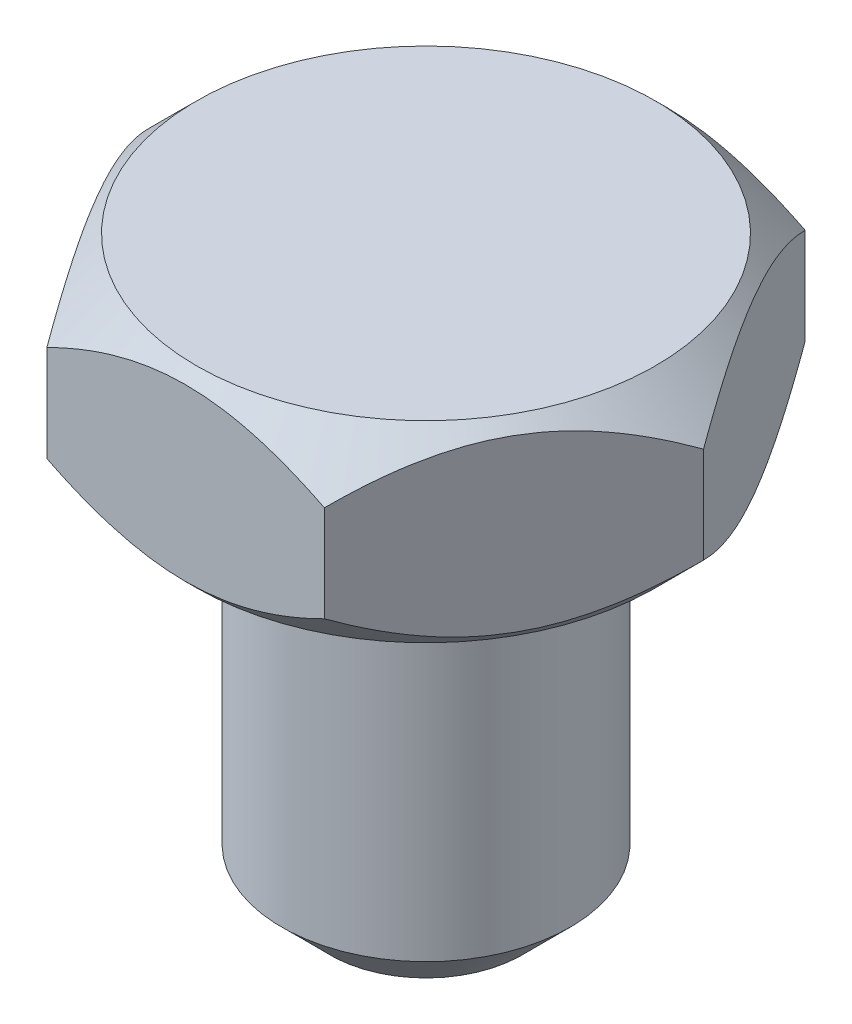
ISO-10303-21;
HEADER;
FILE_DESCRIPTION(('STEP AP214'),'2;1');
FILE_NAME('part.step','',(''),(''),'','','');
FILE_SCHEMA(('AUTOMOTIVE_DESIGN { 1 0 10303 214 1 1 1 1 }'));
ENDSEC;
DATA;
#1=APPLICATION_CONTEXT('core data for automotive mechanical design processes');
#2=APPLICATION_PROTOCOL_DEFINITION('international standard','automotive_design',2000,#1);
#3=PRODUCT_CONTEXT('',#1,'mechanical');
#4=PRODUCT('Part','Part','',(#3));
#5=PRODUCT_RELATED_PRODUCT_CATEGORY('part','',(#4));
#6=PRODUCT_DEFINITION_FORMATION('','',#4);
#7=PRODUCT_DEFINITION_CONTEXT('part definition',#1,'design');
#8=PRODUCT_DEFINITION('design','',#6,#7);
#9=PRODUCT_DEFINITION_SHAPE('','',#8);
#10=(LENGTH_UNIT() NAMED_UNIT(*) SI_UNIT(.MILLI.,.METRE.));
#11=(NAMED_UNIT(*) PLANE_ANGLE_UNIT() SI_UNIT($,.RADIAN.));
#12=(NAMED_UNIT(*) SI_UNIT($,.STERADIAN.) SOLID_ANGLE_UNIT());
#13=UNCERTAINTY_MEASURE_WITH_UNIT(LENGTH_MEASURE(1.E-05),#10,'distance_accuracy_value','');
#14=(GEOMETRIC_REPRESENTATION_CONTEXT(3) GLOBAL_UNCERTAINTY_ASSIGNED_CONTEXT((#13)) GLOBAL_UNIT_ASSIGNED_CONTEXT((#10,
#11,#12)) REPRESENTATION_CONTEXT('',''));
#15=CARTESIAN_POINT('',(0.,0.,0.));
#16=DIRECTION('',(0.,0.,1.));
#17=DIRECTION('',(1.,0.,0.));
#18=AXIS2_PLACEMENT_3D('',#15,#16,#17);
#19=CARTESIAN_POINT('',(-2.88675134594812,-4.,-4.99999999999999));
#20=DIRECTION('',(0.,-1.,0.));
#21=DIRECTION('',(0.,0.,-1.));
#22=AXIS2_PLACEMENT_3D('',#19,#20,#21);
#23=PLANE('',#22);
#24=CARTESIAN_POINT('',(0.,-4.,0.));
#25=DIRECTION('',(0.,1.,0.));
#26=DIRECTION('',(0.,0.,1.));
#27=AXIS2_PLACEMENT_3D('',#24,#25,#26);
#28=CIRCLE('',#27,4.77350269189625);
#29=CARTESIAN_POINT('',(0.,-4.,4.77350269189625));
#30=VERTEX_POINT('',#29);
#31=EDGE_CURVE('E102',#30,#30,#28,.T.);
#32=ORIENTED_EDGE('',*,*,#31,.F.);
#33=EDGE_LOOP('',(#32));
#34=FACE_BOUND('',#33,.T.);
#35=CARTESIAN_POINT('',(0.,-4.,0.));
#36=DIRECTION('',(0.,-1.,0.));
#37=DIRECTION('',(0.,0.,-1.));
#38=AXIS2_PLACEMENT_3D('',#35,#36,#37);
#39=CIRCLE('',#38,3.);
#40=CARTESIAN_POINT('',(0.,-4.,-3.));
#41=VERTEX_POINT('',#40);
#42=EDGE_CURVE('E116',#41,#41,#39,.T.);
#43=ORIENTED_EDGE('',*,*,#42,.F.);
#44=EDGE_LOOP('',(#43));
#45=FACE_BOUND('',#44,.T.);
#46=ADVANCED_FACE('F29',(#34,#45),#23,.T.);
#47=CARTESIAN_POINT('',(0.,-12.,0.));
#48=DIRECTION('',(0.,1.,0.));
#49=DIRECTION('',(0.,0.,1.));
#50=AXIS2_PLACEMENT_3D('',#47,#48,#49);
#51=CYLINDRICAL_SURFACE('',#50,3.);
#52=CARTESIAN_POINT('',(0.,-11.,0.));
#53=DIRECTION('',(0.,-1.,0.));
#54=DIRECTION('',(0.,0.,-1.));
#55=AXIS2_PLACEMENT_3D('',#52,#53,#54);
#56=CIRCLE('',#55,3.);
#57=CARTESIAN_POINT('',(0.,-11.,-3.));
#58=VERTEX_POINT('',#57);
#59=EDGE_CURVE('E42',#58,#58,#56,.F.);
#60=ORIENTED_EDGE('',*,*,#59,.T.);
#61=EDGE_LOOP('',(#60));
#62=FACE_BOUND('',#61,.T.);
#63=ORIENTED_EDGE('',*,*,#42,.T.);
#64=EDGE_LOOP('',(#63));
#65=FACE_BOUND('',#64,.T.);
#66=ADVANCED_FACE('F123',(#62,#65),#51,.T.);
#67=CARTESIAN_POINT('',(0.,-12.,0.));
#68=DIRECTION('',(0.,-1.,0.));
#69=DIRECTION('',(0.,0.,-1.));
#70=AXIS2_PLACEMENT_3D('',#67,#68,#69);
#71=PLANE('',#70);
#72=CARTESIAN_POINT('',(0.,-12.,0.));
#73=DIRECTION('',(0.,-1.,0.));
#74=DIRECTION('',(0.,0.,-1.));
#75=AXIS2_PLACEMENT_3D('',#72,#73,#74);
#76=CIRCLE('',#75,2.);
#77=CARTESIAN_POINT('',(0.,-12.,-2.));
#78=VERTEX_POINT('',#77);
#79=EDGE_CURVE('E117',#78,#78,#76,.T.);
#80=ORIENTED_EDGE('',*,*,#79,.T.);
#81=EDGE_LOOP('',(#80));
#82=FACE_BOUND('',#81,.T.);
#83=ADVANCED_FACE('F129',(#82),#71,.T.);
#84=CARTESIAN_POINT('',(0.,-12.,0.));
#85=DIRECTION('',(0.,1.,0.));
#86=DIRECTION('',(0.,0.,1.));
#87=AXIS2_PLACEMENT_3D('',#84,#85,#86);
#88=CONICAL_SURFACE('',#87,2.,0.785398163397447);
#89=ORIENTED_EDGE('',*,*,#59,.F.);
#90=EDGE_LOOP('',(#89));
#91=FACE_BOUND('',#90,.T.);
#92=ORIENTED_EDGE('',*,*,#79,.F.);
#93=EDGE_LOOP('',(#92));
#94=FACE_BOUND('',#93,.T.);
#95=ADVANCED_FACE('F126',(#91,#94),#88,.T.);
#96=CARTESIAN_POINT('',(0.,-4.,0.));
#97=DIRECTION('',(0.,1.,0.));
#98=DIRECTION('',(0.,0.,1.));
#99=AXIS2_PLACEMENT_3D('',#96,#97,#98);
#100=CONICAL_SURFACE('',#99,4.77350269189625,0.785398163397448);
#101=CARTESIAN_POINT('',(-5.77361816195009,-2.99988452648213,0.000200000000039934));
#102=CARTESIAN_POINT('',(-5.72398176110225,-3.04951645439574,-0.0857727681732677));
#103=CARTESIAN_POINT('',(-5.6739638280717,-3.0976252747131,-0.17240636947177));
#104=CARTESIAN_POINT('',(-5.57309004377303,-3.19033336867022,-0.3471248890288));
#105=CARTESIAN_POINT('',(-5.52223375293569,-3.23493072549852,-0.435210568643571));
#106=CARTESIAN_POINT('',(-5.36782257743899,-3.36314092787175,-0.702658569860292));
#107=CARTESIAN_POINT('',(-5.26296050943971,-3.44062493449848,-0.884284999421792));
#108=CARTESIAN_POINT('',(-5.05149774994706,-3.57331105557449,-1.25054924277179));
#109=CARTESIAN_POINT('',(-4.94495110937142,-3.62884745935417,-1.43509343762457));
#110=CARTESIAN_POINT('',(-4.78337944338746,-3.69308950595249,-1.71494377217234));
#111=CARTESIAN_POINT('',(-4.72928433986568,-3.71131783666137,-1.80863923991277));
#112=CARTESIAN_POINT('',(-4.62063609179559,-3.74100781287389,-1.9968235257235));
#113=CARTESIAN_POINT('',(-4.56608301694085,-3.75247046969492,-2.09131222308102));
#114=CARTESIAN_POINT('',(-4.43314578685872,-3.77168913825403,-2.32156625980075));
#115=CARTESIAN_POINT('',(-4.35461839928598,-3.7757217117403,-2.4575796848624));
#116=CARTESIAN_POINT('',(-4.19770514602325,-3.7689541458947,-2.72936141189436));
#117=CARTESIAN_POINT('',(-4.11931933958609,-3.75814880702901,-2.86512961123579));
#118=CARTESIAN_POINT('',(-3.96328672226451,-3.72234235010197,-3.13538603207472));
#119=CARTESIAN_POINT('',(-3.88564083675503,-3.69732535604175,-3.26987265077581));
#120=CARTESIAN_POINT('',(-3.73168360440634,-3.63445567501058,-3.53653439939643));
#121=CARTESIAN_POINT('',(-3.65537215571136,-3.59660397223245,-3.66870970573533));
#122=CARTESIAN_POINT('',(-3.51990355411976,-3.51873011323948,-3.90334820652228));
#123=CARTESIAN_POINT('',(-3.4604464736886,-3.480755749581,-4.00633089069876));
#124=CARTESIAN_POINT('',(-3.34259967462161,-3.39868737382607,-4.21044753419214));
#125=CARTESIAN_POINT('',(-3.28420998845894,-3.35459317589646,-4.31158143726389));
#126=CARTESIAN_POINT('',(-3.16868188148908,-3.26127361464765,-4.51168198823795));
#127=CARTESIAN_POINT('',(-3.11154017495448,-3.21206438729062,-4.61065432718707));
#128=CARTESIAN_POINT('',(-2.99831490663731,-3.109160877157,-4.80676624461303));
#129=CARTESIAN_POINT('',(-2.94223072132828,-3.05546934545098,-4.90390690306937));
#130=CARTESIAN_POINT('',(-2.88663587589429,-2.99988452648214,-5.00019999999999));
#131=B_SPLINE_CURVE_WITH_KNOTS('',3,(#101,#102,#103,#104,#105,#106,#107,#108,#109,#110,#111,
#112,#113,#114,#115,#116,#117,#118,#119,#120,#121,#122,#123,#124,#125,#126,#127,#128,#129,#130),
.UNSPECIFIED.,.F.,.F.,(4,2,2,2,2,2,2,2,2,2,2,2,2,2,4),(0.,0.332945616209569,0.666071736106993,
1.33592065243335,1.99513262597482,2.32409207808825,2.65300234563692,3.12358963991984,
3.59434188052354,4.06562104077027,4.5368640704961,4.91117956742317,5.28550643319671,
5.65868635377117,6.03163889109475),.UNSPECIFIED.);
#132=CARTESIAN_POINT('',(-5.77350269189625,-3.,0.));
#133=VERTEX_POINT('',#132);
#134=CARTESIAN_POINT('',(-2.88675134594813,-3.,-4.99999999999999));
#135=VERTEX_POINT('',#134);
#136=EDGE_CURVE('E174',#133,#135,#131,.T.);
#137=ORIENTED_EDGE('',*,*,#136,.T.);
#138=CARTESIAN_POINT('',(-5.93336867910423,-1.0143233614403,-4.99999999999999));
#139=CARTESIAN_POINT('',(-5.78966341948587,-1.1241885817879,-4.99999999999999));
#140=CARTESIAN_POINT('',(-5.64517359422455,-1.23304389822759,-4.99999999999999));
#141=CARTESIAN_POINT('',(-5.35430787651161,-1.44827641705777,-4.99999999999999));
#142=CARTESIAN_POINT('',(-5.20793153723386,-1.55465301495845,-4.99999999999999));
#143=CARTESIAN_POINT('',(-4.9119053610751,-1.76522692025996,-4.99999999999999));
#144=CARTESIAN_POINT('',(-4.7622389674382,-1.86940102910427,-4.99999999999999));
#145=CARTESIAN_POINT('',(-4.4603979301907,-2.07403749362642,-4.99999999999999));
#146=CARTESIAN_POINT('',(-4.30822346176151,-2.17450010696542,-4.99999999999999));
#147=CARTESIAN_POINT('',(-3.99153933620166,-2.37689028562685,-4.99999999999999));
#148=CARTESIAN_POINT('',(-3.82684512877714,-2.47853053625136,-4.99999999999999));
#149=CARTESIAN_POINT('',(-3.49359569305951,-2.67537782448448,-4.99999999999999));
#150=CARTESIAN_POINT('',(-3.32503983391761,-2.77058380079454,-4.99999999999999));
#151=CARTESIAN_POINT('',(-2.98404180965613,-2.95252582018176,-4.99999999999999));
#152=CARTESIAN_POINT('',(-2.81161302726992,-3.03928674909056,-4.99999999999999));
#153=CARTESIAN_POINT('',(-2.4619377508861,-3.20239520740955,-4.99999999999999));
#154=CARTESIAN_POINT('',(-2.28469354573479,-3.27874758379917,-4.99999999999999));
#155=CARTESIAN_POINT('',(-1.94171568558995,-3.41181755173878,-4.99999999999999));
#156=CARTESIAN_POINT('',(-1.77643834256962,-3.46969922851381,-4.99999999999999));
#157=CARTESIAN_POINT('',(-1.44175059438624,-3.57222452709261,-4.99999999999999));
#158=CARTESIAN_POINT('',(-1.27233991994473,-3.61686728390092,-4.99999999999999));
#159=CARTESIAN_POINT('',(-0.933301891878295,-3.68978435588989,-4.99999999999999));
#160=CARTESIAN_POINT('',(-0.763738295172394,-3.71835018807338,-4.99999999999999));
#161=CARTESIAN_POINT('',(-0.422603458667702,-3.75853073066782,-4.99999999999999));
#162=CARTESIAN_POINT('',(-0.251032616590633,-3.7701487436941,-4.99999999999999));
#163=CARTESIAN_POINT('',(0.0853406388539586,-3.77548648250807,-4.99999999999999));
#164=CARTESIAN_POINT('',(0.250131876658651,-3.76992113564033,-4.99999999999999));
#165=CARTESIAN_POINT('',(0.578387101858167,-3.74282076274746,-4.99999999999999));
#166=CARTESIAN_POINT('',(0.741850964252607,-3.72128424993436,-4.99999999999999));
#167=CARTESIAN_POINT('',(1.06903592592894,-3.66307865086045,-4.99999999999999));
#168=CARTESIAN_POINT('',(1.23270929845992,-3.62614570544629,-4.99999999999999));
#169=CARTESIAN_POINT('',(1.55646565066118,-3.53916921466345,-4.99999999999999));
#170=CARTESIAN_POINT('',(1.71654886698276,-3.48912653621913,-4.99999999999999));
#171=CARTESIAN_POINT('',(2.04376834721888,-3.37425220624934,-4.99999999999999));
#172=CARTESIAN_POINT('',(2.21062650526836,-3.30863700466564,-4.99999999999999));
#173=CARTESIAN_POINT('',(2.54003854131556,-3.16728810798752,-4.99999999999999));
#174=CARTESIAN_POINT('',(2.7025904176521,-3.0915498029936,-4.99999999999999));
#175=CARTESIAN_POINT('',(3.02416565802373,-2.9317524021677,-4.99999999999999));
#176=CARTESIAN_POINT('',(3.1831761026048,-2.84766751767455,-4.99999999999999));
#177=CARTESIAN_POINT('',(3.49754870709798,-2.67302987151769,-4.99999999999999));
#178=CARTESIAN_POINT('',(3.65291142946937,-2.58247811583028,-4.99999999999999));
#179=CARTESIAN_POINT('',(3.95285892432342,-2.40078159251411,-4.99999999999999));
#180=CARTESIAN_POINT('',(4.09759659911003,-2.30988790532247,-4.99999999999999));
#181=CARTESIAN_POINT('',(4.38458573992775,-2.12424528238796,-4.99999999999999));
#182=CARTESIAN_POINT('',(4.52683701776729,-2.02949605661615,-4.99999999999999));
#183=CARTESIAN_POINT('',(4.80803186770968,-1.83760520698687,-4.99999999999999));
#184=CARTESIAN_POINT('',(4.94699285705844,-1.74048901451515,-4.99999999999999));
#185=CARTESIAN_POINT('',(5.22301057132509,-1.54366358089934,-4.99999999999999));
#186=CARTESIAN_POINT('',(5.36006781033932,-1.44395506153836,-4.99999999999999));
#187=CARTESIAN_POINT('',(5.49632687048856,-1.34318580314551,-4.99999999999999));
#188=B_SPLINE_CURVE_WITH_KNOTS('',3,(#138,#139,#140,#141,#142,#143,#144,#145,#146,#147,#148,
#149,#150,#151,#152,#153,#154,#155,#156,#157,#158,#159,#160,#161,#162,#163,#164,#165,#166,#167,
#168,#169,#170,#171,#172,#173,#174,#175,#176,#177,#178,#179,#180,#181,#182,#183,#184,#185,#186,
#187),.UNSPECIFIED.,.F.,.F.,(4,2,2,2,2,2,2,2,2,2,2,2,2,2,2,2,2,2,2,2,2,2,2,2,4),(0.,
0.542683335711663,1.08549766009344,1.63250741832322,2.17947913015188,2.75996048819956,
3.34053736097748,3.91934802264124,4.49788822043794,5.02279153401111,5.54772913580436,
6.06281331680062,6.57779711011592,7.0716474990381,7.56554386725873,8.06827708076712,
8.57097705777059,9.10845041736518,9.64616937298291,10.1856047538602,10.7249564030361,
11.2376185039342,11.7503192408631,12.2588884723274,12.7673175877714),.UNSPECIFIED.);
#189=CARTESIAN_POINT('',(2.88675134594814,-3.,-4.99999999999999));
#190=VERTEX_POINT('',#189);
#191=EDGE_CURVE('E168',#135,#190,#188,.T.);
#192=ORIENTED_EDGE('',*,*,#191,.T.);
#193=CARTESIAN_POINT('',(2.8866358758943,-2.99988452648213,-5.00019999999999));
#194=CARTESIAN_POINT('',(2.93627227674214,-3.04951645439574,-4.91422723182668));
#195=CARTESIAN_POINT('',(2.98629020977269,-3.09762527471309,-4.82759363052818));
#196=CARTESIAN_POINT('',(3.08716399407136,-3.19033336867022,-4.65287511097115));
#197=CARTESIAN_POINT('',(3.1380202849087,-3.23493072549851,-4.56478943135638));
#198=CARTESIAN_POINT('',(3.2924314604054,-3.36314092787174,-4.29734143013966));
#199=CARTESIAN_POINT('',(3.39729352840468,-3.44062493449848,-4.11571500057816));
#200=CARTESIAN_POINT('',(3.60875628789733,-3.57331105557448,-3.74945075722817));
#201=CARTESIAN_POINT('',(3.71530292847297,-3.62884745935416,-3.56490656237539));
#202=CARTESIAN_POINT('',(3.87687459445693,-3.69308950595248,-3.28505622782762));
#203=CARTESIAN_POINT('',(3.93096969797871,-3.71131783666136,-3.1913607600872));
#204=CARTESIAN_POINT('',(4.03961794604879,-3.74100781287387,-3.00317647427646));
#205=CARTESIAN_POINT('',(4.09417102090353,-3.75247046969491,-2.90868777691894));
#206=CARTESIAN_POINT('',(4.22710825098566,-3.77168913825401,-2.67843374019922));
#207=CARTESIAN_POINT('',(4.30563563855841,-3.77572171174028,-2.54242031513757));
#208=CARTESIAN_POINT('',(4.46254889182113,-3.76895414589469,-2.2706385881056));
#209=CARTESIAN_POINT('',(4.5409346982583,-3.758148807029,-2.13487038876418));
#210=CARTESIAN_POINT('',(4.69696731557988,-3.72234235010196,-1.86461396792524));
#211=CARTESIAN_POINT('',(4.77461320108935,-3.69732535604173,-1.73012734922416));
#212=CARTESIAN_POINT('',(4.92857043343804,-3.63445567501056,-1.46346560060354));
#213=CARTESIAN_POINT('',(5.00488188213303,-3.59660397223244,-1.33129029426463));
#214=CARTESIAN_POINT('',(5.14035048372462,-3.51873011323946,-1.09665179347768));
#215=CARTESIAN_POINT('',(5.19980756415579,-3.48075574958098,-0.993669109301198));
#216=CARTESIAN_POINT('',(5.31765436322278,-3.39868737382605,-0.789552465807815));
#217=CARTESIAN_POINT('',(5.37604404938545,-3.35459317589644,-0.688418562736064));
#218=CARTESIAN_POINT('',(5.49157215635532,-3.26127361464763,-0.488318011762002));
#219=CARTESIAN_POINT('',(5.54871386288992,-3.21206438729059,-0.389345672812883));
#220=CARTESIAN_POINT('',(5.66193913120709,-3.10916087715698,-0.193233755386925));
#221=CARTESIAN_POINT('',(5.71802331651611,-3.05546934545096,-0.0960930969305827));
#222=CARTESIAN_POINT('',(5.77361816195011,-2.99988452648211,0.000200000000038896));
#223=B_SPLINE_CURVE_WITH_KNOTS('',3,(#193,#194,#195,#196,#197,#198,#199,#200,#201,#202,#203,
#204,#205,#206,#207,#208,#209,#210,#211,#212,#213,#214,#215,#216,#217,#218,#219,#220,#221,#222),
.UNSPECIFIED.,.F.,.F.,(4,2,2,2,2,2,2,2,2,2,2,2,2,2,4),(0.,0.332945616209567,0.666071736106988,
1.33592065243334,1.99513262597481,2.32409207808823,2.6530023456369,3.12358963991982,
3.59434188052352,4.06562104077025,4.53686407049609,4.91117956742316,5.28550643319671,
5.65868635377117,6.03163889109475),.UNSPECIFIED.);
#224=CARTESIAN_POINT('',(5.77350269189625,-3.,0.));
#225=VERTEX_POINT('',#224);
#226=EDGE_CURVE('E90',#190,#225,#223,.T.);
#227=ORIENTED_EDGE('',*,*,#226,.T.);
#228=CARTESIAN_POINT('',(5.77361816195011,-2.99988452648211,-0.000199999999961444));
#229=CARTESIAN_POINT('',(5.72398176110227,-3.04951645439572,0.0857727681733452));
#230=CARTESIAN_POINT('',(5.67396382807171,-3.09762527471308,0.172406369471847));
#231=CARTESIAN_POINT('',(5.57309004377305,-3.1903333686702,0.347124889028876));
#232=CARTESIAN_POINT('',(5.52223375293571,-3.23493072549849,0.435210568643646));
#233=CARTESIAN_POINT('',(5.36782257743901,-3.36314092787172,0.702658569860365));
#234=CARTESIAN_POINT('',(5.26296050943973,-3.44062493449846,0.884284999421863));
#235=CARTESIAN_POINT('',(5.05149774994707,-3.57331105557446,1.25054924277185));
#236=CARTESIAN_POINT('',(4.94495110937143,-3.62884745935414,1.43509343762464));
#237=CARTESIAN_POINT('',(4.78337944338747,-3.69308950595246,1.71494377217241));
#238=CARTESIAN_POINT('',(4.72928433986569,-3.71131783666134,1.80863923991283));
#239=CARTESIAN_POINT('',(4.62063609179561,-3.74100781287386,1.99682352572356));
#240=CARTESIAN_POINT('',(4.56608301694086,-3.75247046969489,2.09131222308108));
#241=CARTESIAN_POINT('',(4.43314578685873,-3.77168913825399,2.3215662598008));
#242=CARTESIAN_POINT('',(4.35461839928598,-3.77572171174026,2.45757968486246));
#243=CARTESIAN_POINT('',(4.19770514602326,-3.76895414589467,2.72936141189442));
#244=CARTESIAN_POINT('',(4.11931933958609,-3.75814880702898,2.86512961123585));
#245=CARTESIAN_POINT('',(3.96328672226451,-3.72234235010194,3.13538603207478));
#246=CARTESIAN_POINT('',(3.88564083675503,-3.69732535604171,3.26987265077587));
#247=CARTESIAN_POINT('',(3.73168360440634,-3.63445567501054,3.53653439939649));
#248=CARTESIAN_POINT('',(3.65537215571135,-3.59660397223241,3.66870970573539));
#249=CARTESIAN_POINT('',(3.51990355411976,-3.51873011323944,3.90334820652233));
#250=CARTESIAN_POINT('',(3.46044647368859,-3.48075574958096,4.00633089069881));
#251=CARTESIAN_POINT('',(3.34259967462161,-3.39868737382603,4.21044753419218));
#252=CARTESIAN_POINT('',(3.28420998845894,-3.35459317589643,4.31158143726393));
#253=CARTESIAN_POINT('',(3.16868188148908,-3.26127361464762,4.51168198823798));
#254=CARTESIAN_POINT('',(3.11154017495448,-3.21206438729059,4.6106543271871));
#255=CARTESIAN_POINT('',(2.99831490663731,-3.10916087715698,4.80676624461305));
#256=CARTESIAN_POINT('',(2.94223072132829,-3.05546934545097,4.90390690306938));
#257=CARTESIAN_POINT('',(2.8866358758943,-2.99988452648212,5.0002));
#258=B_SPLINE_CURVE_WITH_KNOTS('',3,(#228,#229,#230,#231,#232,#233,#234,#235,#236,#237,#238,
#239,#240,#241,#242,#243,#244,#245,#246,#247,#248,#249,#250,#251,#252,#253,#254,#255,#256,#257),
.UNSPECIFIED.,.F.,.F.,(4,2,2,2,2,2,2,2,2,2,2,2,2,2,4),(0.,0.332945616209567,0.666071736106989,
1.33592065243334,1.99513262597481,2.32409207808823,2.6530023456369,3.12358963991982,
3.59434188052353,4.06562104077026,4.5368640704961,4.91117956742315,5.28550643319668,
5.65868635377112,6.03163889109469),.UNSPECIFIED.);
#259=CARTESIAN_POINT('',(2.88675134594812,-3.,5.));
#260=VERTEX_POINT('',#259);
#261=EDGE_CURVE('E86',#225,#260,#258,.T.);
#262=ORIENTED_EDGE('',*,*,#261,.T.);
#263=CARTESIAN_POINT('',(-5.93336867913979,-1.01432336141309,5.));
#264=CARTESIAN_POINT('',(-5.78966341952042,-1.12418858176174,5.));
#265=CARTESIAN_POINT('',(-5.64517359425808,-1.23304389820249,5.));
#266=CARTESIAN_POINT('',(-5.35430787654308,-1.44827641703476,5.));
#267=CARTESIAN_POINT('',(-5.20793153726431,-1.55465301493648,5.));
#268=CARTESIAN_POINT('',(-4.91190536110345,-1.76522692024009,5.));
#269=CARTESIAN_POINT('',(-4.76223896746549,-1.86940102908545,5.));
#270=CARTESIAN_POINT('',(-4.46039793021584,-2.07403749360968,5.));
#271=CARTESIAN_POINT('',(-4.30822346178557,-2.17450010694972,5.));
#272=CARTESIAN_POINT('',(-3.99153933622338,-2.37689028561331,5.));
#273=CARTESIAN_POINT('',(-3.82684512879759,-2.47853053623893,5.));
#274=CARTESIAN_POINT('',(-3.49359569307741,-2.67537782447423,5.));
#275=CARTESIAN_POINT('',(-3.3250398339342,-2.77058380078536,5.));
#276=CARTESIAN_POINT('',(-2.98404180967006,-2.95252582017463,5.));
#277=CARTESIAN_POINT('',(-2.81161302728251,-3.0392867490844,5.));
#278=CARTESIAN_POINT('',(-2.46193775089592,-3.20239520740523,5.));
#279=CARTESIAN_POINT('',(-2.28469354574318,-3.2787475837957,5.));
#280=CARTESIAN_POINT('',(-1.94171568559774,-3.41181755173593,5.));
#281=CARTESIAN_POINT('',(-1.7764383425783,-3.46969922851087,5.));
#282=CARTESIAN_POINT('',(-1.44175059439672,-3.57222452708967,5.));
#283=CARTESIAN_POINT('',(-1.27233991995613,-3.61686728389806,5.));
#284=CARTESIAN_POINT('',(-0.933301891891501,-3.68978435588743,5.));
#285=CARTESIAN_POINT('',(-0.763738295186488,-3.71835018807121,5.));
#286=CARTESIAN_POINT('',(-0.422603458683547,-3.75853073066644,5.));
#287=CARTESIAN_POINT('',(-0.251032616607341,-3.77014874369322,5.));
#288=CARTESIAN_POINT('',(0.0853406388357411,-3.77548648250835,5.));
#289=CARTESIAN_POINT('',(0.250131876639783,-3.76992113564124,5.));
#290=CARTESIAN_POINT('',(0.578387101838071,-3.74282076274974,5.));
#291=CARTESIAN_POINT('',(0.741850964231932,-3.72128424993737,5.));
#292=CARTESIAN_POINT('',(1.06903592590712,-3.66307865086499,5.));
#293=CARTESIAN_POINT('',(1.23270929843754,-3.62614570545163,5.));
#294=CARTESIAN_POINT('',(1.55646565063773,-3.5391692146704,5.));
#295=CARTESIAN_POINT('',(1.71654886695881,-3.4891265362269,5.));
#296=CARTESIAN_POINT('',(2.04376834719211,-3.3742522062594,5.));
#297=CARTESIAN_POINT('',(2.21062650523935,-3.30863700467733,5.));
#298=CARTESIAN_POINT('',(2.54003854128215,-3.16728810800261,5.));
#299=CARTESIAN_POINT('',(2.70259041761655,-3.09154980301047,5.));
#300=CARTESIAN_POINT('',(3.02416565798398,-2.93175240218824,5.));
#301=CARTESIAN_POINT('',(3.18317610256299,-2.84766751769698,5.));
#302=CARTESIAN_POINT('',(3.49754870705211,-2.67302987154396,5.));
#303=CARTESIAN_POINT('',(3.65291142942151,-2.58247811585849,5.));
#304=CARTESIAN_POINT('',(3.95285892427193,-2.40078159254602,5.));
#305=CARTESIAN_POINT('',(4.09759659905692,-2.30988790535612,5.));
#306=CARTESIAN_POINT('',(4.38458573987138,-2.1242452824251,5.));
#307=CARTESIAN_POINT('',(4.52683701770932,-2.02949605665505,5.));
#308=CARTESIAN_POINT('',(4.80803186764853,-1.83760520702925,5.));
#309=CARTESIAN_POINT('',(4.94699285699572,-1.74048901455926,5.));
#310=CARTESIAN_POINT('',(5.22301057125923,-1.54366358094691,5.));
#311=CARTESIAN_POINT('',(5.3600678102719,-1.44395506158765,5.));
#312=CARTESIAN_POINT('',(5.49632687041958,-1.34318580319653,5.));
#313=B_SPLINE_CURVE_WITH_KNOTS('',3,(#263,#264,#265,#266,#267,#268,#269,#270,#271,#272,#273,
#274,#275,#276,#277,#278,#279,#280,#281,#282,#283,#284,#285,#286,#287,#288,#289,#290,#291,#292,
#293,#294,#295,#296,#297,#298,#299,#300,#301,#302,#303,#304,#305,#306,#307,#308,#309,#310,#311,
#312),.UNSPECIFIED.,.F.,.F.,(4,2,2,2,2,2,2,2,2,2,2,2,2,2,2,2,2,2,2,2,2,2,2,2,4),(0.,
0.542683335716004,1.08549766010212,1.63250741833633,2.17947913016941,2.75996048822207,
3.34053736100496,3.91934802267365,4.49788822047528,5.02279153404586,5.54772913583653,
6.06281331683033,6.57779711014316,7.07164749906334,7.56554386728196,8.06827708078817,
8.57097705778948,9.108450417376,9.64616937298566,10.1856047538548,10.7249564030226,
11.2376185039138,11.7503192408357,12.2588884722932,12.7673175877304),.UNSPECIFIED.);
#314=CARTESIAN_POINT('',(-2.88675134594811,-3.,5.));
#315=VERTEX_POINT('',#314);
#316=EDGE_CURVE('E48',#260,#315,#313,.F.);
#317=ORIENTED_EDGE('',*,*,#316,.T.);
#318=CARTESIAN_POINT('',(-2.88663587589427,-2.99988452648213,5.0002));
#319=CARTESIAN_POINT('',(-2.93627227674211,-3.04951645439574,4.9142272318267));
#320=CARTESIAN_POINT('',(-2.98629020977267,-3.0976252747131,4.82759363052819));
#321=CARTESIAN_POINT('',(-3.08716399407133,-3.19033336867022,4.65287511097117));
#322=CARTESIAN_POINT('',(-3.13802028490867,-3.23493072549851,4.5647894313564));
#323=CARTESIAN_POINT('',(-3.29243146040537,-3.36314092787174,4.29734143013968));
#324=CARTESIAN_POINT('',(-3.39729352840465,-3.44062493449848,4.11571500057818));
#325=CARTESIAN_POINT('',(-3.60875628789731,-3.57331105557448,3.74945075722819));
#326=CARTESIAN_POINT('',(-3.71530292847294,-3.62884745935416,3.56490656237541));
#327=CARTESIAN_POINT('',(-3.8768745944569,-3.69308950595248,3.28505622782764));
#328=CARTESIAN_POINT('',(-3.93096969797869,-3.71131783666136,3.19136076008722));
#329=CARTESIAN_POINT('',(-4.03961794604877,-3.74100781287387,3.00317647427649));
#330=CARTESIAN_POINT('',(-4.09417102090351,-3.75247046969491,2.90868777691897));
#331=CARTESIAN_POINT('',(-4.22710825098564,-3.77168913825401,2.67843374019925));
#332=CARTESIAN_POINT('',(-4.30563563855839,-3.77572171174028,2.5424203151376));
#333=CARTESIAN_POINT('',(-4.46254889182112,-3.76895414589469,2.27063858810564));
#334=CARTESIAN_POINT('',(-4.54093469825828,-3.758148807029,2.13487038876421));
#335=CARTESIAN_POINT('',(-4.69696731557987,-3.72234235010196,1.86461396792528));
#336=CARTESIAN_POINT('',(-4.77461320108934,-3.69732535604173,1.73012734922419));
#337=CARTESIAN_POINT('',(-4.92857043343803,-3.63445567501056,1.46346560060357));
#338=CARTESIAN_POINT('',(-5.00488188213302,-3.59660397223243,1.33129029426467));
#339=CARTESIAN_POINT('',(-5.14035048372461,-3.51873011323946,1.09665179347773));
#340=CARTESIAN_POINT('',(-5.19980756415578,-3.48075574958098,0.993669109301244));
#341=CARTESIAN_POINT('',(-5.31765436322276,-3.39868737382605,0.789552465807868));
#342=CARTESIAN_POINT('',(-5.37604404938544,-3.35459317589644,0.68841856273612));
#343=CARTESIAN_POINT('',(-5.4915721563553,-3.26127361464764,0.488318011762065));
#344=CARTESIAN_POINT('',(-5.5487138628899,-3.21206438729061,0.389345672812949));
#345=CARTESIAN_POINT('',(-5.66193913120707,-3.10916087715699,0.193233755386997));
#346=CARTESIAN_POINT('',(-5.71802331651609,-3.05546934545098,0.0960930969306584));
#347=CARTESIAN_POINT('',(-5.77361816195009,-2.99988452648213,-0.000199999999959808));
#348=B_SPLINE_CURVE_WITH_KNOTS('',3,(#318,#319,#320,#321,#322,#323,#324,#325,#326,#327,#328,
#329,#330,#331,#332,#333,#334,#335,#336,#337,#338,#339,#340,#341,#342,#343,#344,#345,#346,#347),
.UNSPECIFIED.,.F.,.F.,(4,2,2,2,2,2,2,2,2,2,2,2,2,2,4),(0.,0.332945616209565,0.666071736106984,
1.33592065243333,1.9951326259748,2.32409207808822,2.65300234563688,3.12358963991981,
3.59434188052351,4.06562104077024,4.53686407049607,4.91117956742313,5.28550643319667,
5.65868635377112,6.03163889109469),.UNSPECIFIED.);
#349=EDGE_CURVE('E11',#315,#133,#348,.T.);
#350=ORIENTED_EDGE('',*,*,#349,.T.);
#351=EDGE_LOOP('',(#137,#192,#227,#262,#317,#350));
#352=FACE_BOUND('',#351,.T.);
#353=ORIENTED_EDGE('',*,*,#31,.T.);
#354=EDGE_LOOP('',(#353));
#355=FACE_BOUND('',#354,.T.);
#356=ADVANCED_FACE('F87',(#352,#355),#100,.T.);
#357=CARTESIAN_POINT('',(-2.88675134594812,0.,-4.99999999999999));
#358=DIRECTION('',(0.,-1.,0.));
#359=DIRECTION('',(0.,0.,-1.));
#360=AXIS2_PLACEMENT_3D('',#357,#358,#359);
#361=PLANE('',#360);
#362=CARTESIAN_POINT('',(0.,0.,0.));
#363=DIRECTION('',(0.,1.,0.));
#364=DIRECTION('',(0.,0.,1.));
#365=AXIS2_PLACEMENT_3D('',#362,#363,#364);
#366=CIRCLE('',#365,4.77350269189625);
#367=CARTESIAN_POINT('',(0.,0.,4.77350269189625));
#368=VERTEX_POINT('',#367);
#369=EDGE_CURVE('E234',#368,#368,#366,.T.);
#370=ORIENTED_EDGE('',*,*,#369,.T.);
#371=EDGE_LOOP('',(#370));
#372=FACE_BOUND('',#371,.T.);
#373=ADVANCED_FACE('F149',(#372),#361,.F.);
#374=CARTESIAN_POINT('',(0.,-1.,0.));
#375=DIRECTION('',(0.,-1.,0.));
#376=DIRECTION('',(0.,0.,-1.));
#377=AXIS2_PLACEMENT_3D('',#374,#375,#376);
#378=CONICAL_SURFACE('',#377,5.77350269189625,0.785398163397448);
#379=CARTESIAN_POINT('',(-2.88663587589429,-1.00011547351786,-5.00019999999999));
#380=CARTESIAN_POINT('',(-2.93627227674212,-0.950483545604256,-4.91422723182668));
#381=CARTESIAN_POINT('',(-2.98629020977268,-0.9023747252869,-4.82759363052818));
#382=CARTESIAN_POINT('',(-3.08716399407134,-0.809666631329774,-4.65287511097115));
#383=CARTESIAN_POINT('',(-3.13802028490868,-0.765069274501481,-4.56478943135638));
#384=CARTESIAN_POINT('',(-3.29243146040538,-0.636859072128249,-4.29734143013966));
#385=CARTESIAN_POINT('',(-3.39729352840466,-0.559375065501513,-4.11571500057816));
#386=CARTESIAN_POINT('',(-3.60875628789731,-0.426688944425509,-3.74945075722817));
#387=CARTESIAN_POINT('',(-3.71530292847295,-0.371152540645828,-3.56490656237538));
#388=CARTESIAN_POINT('',(-3.87687459445691,-0.306910494047508,-3.28505622782761));
#389=CARTESIAN_POINT('',(-3.93096969797869,-0.288682163338628,-3.19136076008719));
#390=CARTESIAN_POINT('',(-4.03961794604878,-0.258992187126111,-3.00317647427646));
#391=CARTESIAN_POINT('',(-4.09417102090352,-0.247529530305075,-2.90868777691894));
#392=CARTESIAN_POINT('',(-4.22710825098565,-0.228310861745972,-2.67843374019921));
#393=CARTESIAN_POINT('',(-4.30563563855839,-0.224278288259702,-2.54242031513756));
#394=CARTESIAN_POINT('',(-4.46254889182112,-0.231045854105298,-2.2706385881056));
#395=CARTESIAN_POINT('',(-4.54093469825828,-0.241851192970986,-2.13487038876417));
#396=CARTESIAN_POINT('',(-4.69696731557986,-0.277657649898025,-1.86461396792524));
#397=CARTESIAN_POINT('',(-4.77461320108934,-0.302674643958249,-1.73012734922415));
#398=CARTESIAN_POINT('',(-4.92857043343803,-0.365544324989421,-1.46346560060353));
#399=CARTESIAN_POINT('',(-5.00488188213301,-0.403396027767546,-1.33129029426463));
#400=CARTESIAN_POINT('',(-5.14035048372461,-0.481269886760524,-1.09665179347768));
#401=CARTESIAN_POINT('',(-5.19980756415577,-0.519244250419005,-0.993669109301196));
#402=CARTESIAN_POINT('',(-5.31765436322276,-0.601312626173935,-0.789552465807814));
#403=CARTESIAN_POINT('',(-5.37604404938543,-0.645406824103543,-0.688418562736063));
#404=CARTESIAN_POINT('',(-5.4915721563553,-0.738726385352354,-0.488318011762001));
#405=CARTESIAN_POINT('',(-5.5487138628899,-0.787935612709386,-0.389345672812882));
#406=CARTESIAN_POINT('',(-5.66193913120707,-0.890839122843004,-0.193233755386924));
#407=CARTESIAN_POINT('',(-5.71802331651609,-0.94453065454902,-0.0960930969305818));
#408=CARTESIAN_POINT('',(-5.77361816195009,-1.00011547351787,0.000200000000039443));
#409=B_SPLINE_CURVE_WITH_KNOTS('',3,(#379,#380,#381,#382,#383,#384,#385,#386,#387,#388,#389,
#390,#391,#392,#393,#394,#395,#396,#397,#398,#399,#400,#401,#402,#403,#404,#405,#406,#407,#408),
.UNSPECIFIED.,.F.,.F.,(4,2,2,2,2,2,2,2,2,2,2,2,2,2,4),(0.,0.332945616209568,0.66607173610699,
1.33592065243334,1.99513262597481,2.32409207808824,2.65300234563691,3.12358963991983,
3.59434188052353,4.06562104077026,4.53686407049609,4.91117956742316,5.28550643319671,
5.65868635377117,6.03163889109475),.UNSPECIFIED.);
#410=CARTESIAN_POINT('',(-2.88675134594813,-1.,-4.99999999999999));
#411=VERTEX_POINT('',#410);
#412=CARTESIAN_POINT('',(-5.77350269189625,-1.,0.));
#413=VERTEX_POINT('',#412);
#414=EDGE_CURVE('E221',#411,#413,#409,.T.);
#415=ORIENTED_EDGE('',*,*,#414,.T.);
#416=CARTESIAN_POINT('',(-5.77361816195009,-1.00011547351787,-0.000199999999960101));
#417=CARTESIAN_POINT('',(-5.72398176110225,-0.950483545604261,0.0857727681733466));
#418=CARTESIAN_POINT('',(-5.6739638280717,-0.902374725286905,0.172406369471848));
#419=CARTESIAN_POINT('',(-5.57309004377303,-0.809666631329781,0.347124889028876));
#420=CARTESIAN_POINT('',(-5.52223375293569,-0.765069274501489,0.435210568643646));
#421=CARTESIAN_POINT('',(-5.36782257743899,-0.636859072128259,0.702658569860363));
#422=CARTESIAN_POINT('',(-5.26296050943971,-0.559375065501524,0.884284999421859));
#423=CARTESIAN_POINT('',(-5.05149774994706,-0.426688944425522,1.25054924277185));
#424=CARTESIAN_POINT('',(-4.94495110937142,-0.371152540645844,1.43509343762463));
#425=CARTESIAN_POINT('',(-4.78337944338746,-0.306910494047524,1.7149437721724));
#426=CARTESIAN_POINT('',(-4.72928433986568,-0.288682163338644,1.80863923991282));
#427=CARTESIAN_POINT('',(-4.62063609179559,-0.258992187126128,1.99682352572355));
#428=CARTESIAN_POINT('',(-4.56608301694085,-0.247529530305091,2.09131222308107));
#429=CARTESIAN_POINT('',(-4.43314578685872,-0.228310861745989,2.32156625980079));
#430=CARTESIAN_POINT('',(-4.35461839928597,-0.22427828825972,2.45757968486244));
#431=CARTESIAN_POINT('',(-4.19770514602324,-0.231045854105316,2.72936141189441));
#432=CARTESIAN_POINT('',(-4.11931933958608,-0.241851192971002,2.86512961123583));
#433=CARTESIAN_POINT('',(-3.96328672226449,-0.277657649898043,3.13538603207477));
#434=CARTESIAN_POINT('',(-3.88564083675502,-0.302674643958268,3.26987265077585));
#435=CARTESIAN_POINT('',(-3.73168360440633,-0.36554432498944,3.53653439939647));
#436=CARTESIAN_POINT('',(-3.65537215571134,-0.403396027767565,3.66870970573538));
#437=CARTESIAN_POINT('',(-3.51990355411974,-0.481269886760541,3.90334820652232));
#438=CARTESIAN_POINT('',(-3.46044647368858,-0.519244250419022,4.0063308906988));
#439=CARTESIAN_POINT('',(-3.3425996746216,-0.601312626173949,4.21044753419218));
#440=CARTESIAN_POINT('',(-3.28420998845893,-0.645406824103555,4.31158143726392));
#441=CARTESIAN_POINT('',(-3.16868188148906,-0.738726385352362,4.51168198823798));
#442=CARTESIAN_POINT('',(-3.11154017495446,-0.787935612709392,4.61065432718709));
#443=CARTESIAN_POINT('',(-2.99831490663729,-0.890839122843006,4.80676624461304));
#444=CARTESIAN_POINT('',(-2.94223072132827,-0.94453065454902,4.90390690306938));
#445=CARTESIAN_POINT('',(-2.88663587589427,-1.00011547351787,5.0002));
#446=B_SPLINE_CURVE_WITH_KNOTS('',3,(#416,#417,#418,#419,#420,#421,#422,#423,#424,#425,#426,
#427,#428,#429,#430,#431,#432,#433,#434,#435,#436,#437,#438,#439,#440,#441,#442,#443,#444,#445),
.UNSPECIFIED.,.F.,.F.,(4,2,2,2,2,2,2,2,2,2,2,2,2,2,4),(0.,0.332945616209565,0.666071736106986,
1.33592065243333,1.9951326259748,2.32409207808822,2.65300234563689,3.12358963991981,
3.59434188052351,4.06562104077024,4.53686407049608,4.91117956742314,5.28550643319667,
5.65868635377112,6.03163889109469),.UNSPECIFIED.);
#447=CARTESIAN_POINT('',(-2.88675134594811,-1.,5.00000000000001));
#448=VERTEX_POINT('',#447);
#449=EDGE_CURVE('E237',#413,#448,#446,.T.);
#450=ORIENTED_EDGE('',*,*,#449,.T.);
#451=CARTESIAN_POINT('',(-5.93336867913979,-2.98567663858691,5.));
#452=CARTESIAN_POINT('',(-5.78966341952042,-2.87581141823826,5.));
#453=CARTESIAN_POINT('',(-5.64517359425808,-2.76695610179751,5.));
#454=CARTESIAN_POINT('',(-5.35430787654308,-2.55172358296524,5.));
#455=CARTESIAN_POINT('',(-5.20793153726431,-2.44534698506352,5.));
#456=CARTESIAN_POINT('',(-4.91190536110346,-2.23477307975991,5.));
#457=CARTESIAN_POINT('',(-4.76223896746549,-2.13059897091455,5.));
#458=CARTESIAN_POINT('',(-4.46039793021584,-1.92596250639032,5.));
#459=CARTESIAN_POINT('',(-4.30822346178557,-1.82549989305028,5.));
#460=CARTESIAN_POINT('',(-3.99153933622338,-1.62310971438669,5.));
#461=CARTESIAN_POINT('',(-3.82684512879759,-1.52146946376107,5.));
#462=CARTESIAN_POINT('',(-3.49359569307741,-1.32462217552577,5.));
#463=CARTESIAN_POINT('',(-3.3250398339342,-1.22941619921464,5.));
#464=CARTESIAN_POINT('',(-2.98404180967006,-1.04747417982537,5.));
#465=CARTESIAN_POINT('',(-2.81161302728251,-0.960713250915597,5.));
#466=CARTESIAN_POINT('',(-2.46193775089592,-0.797604792594766,5.));
#467=CARTESIAN_POINT('',(-2.28469354574318,-0.721252416204296,5.));
#468=CARTESIAN_POINT('',(-1.94171568559774,-0.588182448264071,5.));
#469=CARTESIAN_POINT('',(-1.7764383425783,-0.530300771489132,5.));
#470=CARTESIAN_POINT('',(-1.44175059439672,-0.427775472910332,5.));
#471=CARTESIAN_POINT('',(-1.27233991995613,-0.383132716101937,5.));
#472=CARTESIAN_POINT('',(-0.9333018918915,-0.310215644112575,5.));
#473=CARTESIAN_POINT('',(-0.763738295186488,-0.281649811928794,5.));
#474=CARTESIAN_POINT('',(-0.422603458683547,-0.241469269333559,5.));
#475=CARTESIAN_POINT('',(-0.251032616607341,-0.229851256306779,5.));
#476=CARTESIAN_POINT('',(0.085340638835741,-0.224513517491652,5.));
#477=CARTESIAN_POINT('',(0.250131876639783,-0.230078864358759,5.));
#478=CARTESIAN_POINT('',(0.578387101838071,-0.257179237250259,5.));
#479=CARTESIAN_POINT('',(0.741850964231932,-0.278715750062628,5.));
#480=CARTESIAN_POINT('',(1.06903592590712,-0.336921349135011,5.));
#481=CARTESIAN_POINT('',(1.23270929843754,-0.373854294548371,5.));
#482=CARTESIAN_POINT('',(1.55646565063773,-0.460830785329602,5.));
#483=CARTESIAN_POINT('',(1.71654886695881,-0.510873463773105,5.));
#484=CARTESIAN_POINT('',(2.04376834719211,-0.625747793740597,5.));
#485=CARTESIAN_POINT('',(2.21062650523935,-0.691362995322673,5.));
#486=CARTESIAN_POINT('',(2.54003854128215,-0.832711891997393,5.));
#487=CARTESIAN_POINT('',(2.70259041761655,-0.908450196989528,5.));
#488=CARTESIAN_POINT('',(3.02416565798398,-1.06824759781176,5.));
#489=CARTESIAN_POINT('',(3.18317610256299,-1.15233248230302,5.));
#490=CARTESIAN_POINT('',(3.49754870705211,-1.32697012845604,5.));
#491=CARTESIAN_POINT('',(3.65291142942151,-1.41752188414151,5.));
#492=CARTESIAN_POINT('',(3.95285892427193,-1.59921840745398,5.));
#493=CARTESIAN_POINT('',(4.09759659905691,-1.69011209464388,5.));
#494=CARTESIAN_POINT('',(4.38458573987138,-1.8757547175749,5.));
#495=CARTESIAN_POINT('',(4.52683701770932,-1.97050394334495,5.));
#496=CARTESIAN_POINT('',(4.80803186764853,-2.16239479297075,5.));
#497=CARTESIAN_POINT('',(4.94699285699572,-2.25951098544074,5.));
#498=CARTESIAN_POINT('',(5.22301057125923,-2.45633641905309,5.));
#499=CARTESIAN_POINT('',(5.3600678102719,-2.55604493841234,5.));
#500=CARTESIAN_POINT('',(5.49632687041958,-2.65681419680347,5.));
#501=B_SPLINE_CURVE_WITH_KNOTS('',3,(#451,#452,#453,#454,#455,#456,#457,#458,#459,#460,#461,
#462,#463,#464,#465,#466,#467,#468,#469,#470,#471,#472,#473,#474,#475,#476,#477,#478,#479,#480,
#481,#482,#483,#484,#485,#486,#487,#488,#489,#490,#491,#492,#493,#494,#495,#496,#497,#498,#499,
#500),.UNSPECIFIED.,.F.,.F.,(4,2,2,2,2,2,2,2,2,2,2,2,2,2,2,2,2,2,2,2,2,2,2,2,4),(0.,
0.542683335716004,1.08549766010212,1.63250741833633,2.17947913016941,2.75996048822206,
3.34053736100496,3.91934802267365,4.49788822047528,5.02279153404586,5.54772913583653,
6.06281331683033,6.57779711014316,7.07164749906334,7.56554386728196,8.06827708078817,
8.57097705778948,9.10845041737601,9.64616937298566,10.1856047538548,10.7249564030226,
11.2376185039138,11.7503192408357,12.2588884722932,12.7673175877304),.UNSPECIFIED.);
#502=CARTESIAN_POINT('',(2.88675134594812,-1.,5.));
#503=VERTEX_POINT('',#502);
#504=EDGE_CURVE('E208',#448,#503,#501,.T.);
#505=ORIENTED_EDGE('',*,*,#504,.T.);
#506=CARTESIAN_POINT('',(2.8866358758943,-1.00011547351788,5.0002));
#507=CARTESIAN_POINT('',(2.93627227674213,-0.950483545604271,4.91422723182669));
#508=CARTESIAN_POINT('',(2.98629020977269,-0.902374725286916,4.82759363052819));
#509=CARTESIAN_POINT('',(3.08716399407135,-0.809666631329792,4.65287511097117));
#510=CARTESIAN_POINT('',(3.13802028490869,-0.7650692745015,4.5647894313564));
#511=CARTESIAN_POINT('',(3.29243146040539,-0.636859072128271,4.29734143013968));
#512=CARTESIAN_POINT('',(3.39729352840467,-0.559375065501537,4.11571500057818));
#513=CARTESIAN_POINT('',(3.60875628789733,-0.426688944425536,3.74945075722819));
#514=CARTESIAN_POINT('',(3.71530292847296,-0.371152540645857,3.56490656237541));
#515=CARTESIAN_POINT('',(3.87687459445692,-0.306910494047539,3.28505622782765));
#516=CARTESIAN_POINT('',(3.9309696979787,-0.28868216333866,3.19136076008723));
#517=CARTESIAN_POINT('',(4.03961794604879,-0.258992187126145,3.00317647427649));
#518=CARTESIAN_POINT('',(4.09417102090353,-0.247529530305108,2.90868777691898));
#519=CARTESIAN_POINT('',(4.22710825098566,-0.228310861746005,2.67843374019925));
#520=CARTESIAN_POINT('',(4.30563563855841,-0.224278288259736,2.5424203151376));
#521=CARTESIAN_POINT('',(4.46254889182114,-0.231045854105333,2.27063858810564));
#522=CARTESIAN_POINT('',(4.5409346982583,-0.241851192971021,2.13487038876421));
#523=CARTESIAN_POINT('',(4.69696731557988,-0.277657649898062,1.86461396792528));
#524=CARTESIAN_POINT('',(4.77461320108936,-0.302674643958287,1.73012734922419));
#525=CARTESIAN_POINT('',(4.92857043343805,-0.365544324989458,1.46346560060357));
#526=CARTESIAN_POINT('',(5.00488188213304,-0.403396027767583,1.33129029426467));
#527=CARTESIAN_POINT('',(5.14035048372464,-0.48126988676056,1.09665179347773));
#528=CARTESIAN_POINT('',(5.1998075641558,-0.519244250419041,0.993669109301242));
#529=CARTESIAN_POINT('',(5.31765436322278,-0.601312626173969,0.789552465807867));
#530=CARTESIAN_POINT('',(5.37604404938546,-0.645406824103575,0.688418562736119));
#531=CARTESIAN_POINT('',(5.49157215635532,-0.738726385352382,0.488318011762064));
#532=CARTESIAN_POINT('',(5.54871386288992,-0.787935612709412,0.389345672812948));
#533=CARTESIAN_POINT('',(5.66193913120709,-0.890839122843027,0.193233755386996));
#534=CARTESIAN_POINT('',(5.71802331651611,-0.944530654549041,0.0960930969306573));
#535=CARTESIAN_POINT('',(5.77361816195011,-1.00011547351789,-0.000199999999960991));
#536=B_SPLINE_CURVE_WITH_KNOTS('',3,(#506,#507,#508,#509,#510,#511,#512,#513,#514,#515,#516,
#517,#518,#519,#520,#521,#522,#523,#524,#525,#526,#527,#528,#529,#530,#531,#532,#533,#534,#535),
.UNSPECIFIED.,.F.,.F.,(4,2,2,2,2,2,2,2,2,2,2,2,2,2,4),(0.,0.332945616209563,0.666071736106982,
1.33592065243332,1.99513262597479,2.32409207808821,2.65300234563688,3.1235896399198,
3.5943418805235,4.06562104077023,4.53686407049607,4.91117956742313,5.28550643319667,
5.65868635377111,6.03163889109469),.UNSPECIFIED.);
#537=CARTESIAN_POINT('',(5.77350269189625,-1.,0.));
#538=VERTEX_POINT('',#537);
#539=EDGE_CURVE('E107',#503,#538,#536,.T.);
#540=ORIENTED_EDGE('',*,*,#539,.T.);
#541=CARTESIAN_POINT('',(5.77361816195011,-1.00011547351789,0.00020000000003859));
#542=CARTESIAN_POINT('',(5.72398176110227,-0.950483545604279,-0.0857727681732689));
#543=CARTESIAN_POINT('',(5.67396382807171,-0.902374725286923,-0.172406369471771));
#544=CARTESIAN_POINT('',(5.57309004377305,-0.809666631329796,-0.347124889028803));
#545=CARTESIAN_POINT('',(5.52223375293571,-0.765069274501503,-0.435210568643574));
#546=CARTESIAN_POINT('',(5.36782257743901,-0.636859072128269,-0.702658569860297));
#547=CARTESIAN_POINT('',(5.26296050943973,-0.559375065501532,-0.884284999421797));
#548=CARTESIAN_POINT('',(5.05149774994707,-0.426688944425526,-1.25054924277179));
#549=CARTESIAN_POINT('',(4.94495110937144,-0.371152540645845,-1.43509343762458));
#550=CARTESIAN_POINT('',(4.78337944338747,-0.306910494047524,-1.71494377217235));
#551=CARTESIAN_POINT('',(4.72928433986569,-0.288682163338644,-1.80863923991277));
#552=CARTESIAN_POINT('',(4.62063609179561,-0.258992187126127,-1.99682352572351));
#553=CARTESIAN_POINT('',(4.56608301694087,-0.24752953030509,-2.09131222308103));
#554=CARTESIAN_POINT('',(4.43314578685874,-0.228310861745986,-2.32156625980075));
#555=CARTESIAN_POINT('',(4.35461839928599,-0.224278288259717,-2.45757968486241));
#556=CARTESIAN_POINT('',(4.19770514602326,-0.231045854105314,-2.72936141189437));
#557=CARTESIAN_POINT('',(4.1193193395861,-0.241851192971001,-2.8651296112358));
#558=CARTESIAN_POINT('',(3.96328672226452,-0.277657649898041,-3.13538603207473));
#559=CARTESIAN_POINT('',(3.88564083675504,-0.302674643958266,-3.26987265077582));
#560=CARTESIAN_POINT('',(3.73168360440635,-0.365544324989437,-3.53653439939644));
#561=CARTESIAN_POINT('',(3.65537215571137,-0.403396027767562,-3.66870970573534));
#562=CARTESIAN_POINT('',(3.51990355411977,-0.481269886760539,-3.90334820652229));
#563=CARTESIAN_POINT('',(3.46044647368861,-0.519244250419019,-4.00633089069877));
#564=CARTESIAN_POINT('',(3.34259967462163,-0.601312626173948,-4.21044753419215));
#565=CARTESIAN_POINT('',(3.28420998845895,-0.645406824103555,-4.3115814372639));
#566=CARTESIAN_POINT('',(3.16868188148909,-0.738726385352363,-4.51168198823796));
#567=CARTESIAN_POINT('',(3.11154017495449,-0.787935612709394,-4.61065432718708));
#568=CARTESIAN_POINT('',(2.99831490663732,-0.890839122843009,-4.80676624461303));
#569=CARTESIAN_POINT('',(2.9422307213283,-0.944530654549023,-4.90390690306937));
#570=CARTESIAN_POINT('',(2.8866358758943,-1.00011547351787,-5.00019999999999));
#571=B_SPLINE_CURVE_WITH_KNOTS('',3,(#541,#542,#543,#544,#545,#546,#547,#548,#549,#550,#551,
#552,#553,#554,#555,#556,#557,#558,#559,#560,#561,#562,#563,#564,#565,#566,#567,#568,#569,#570),
.UNSPECIFIED.,.F.,.F.,(4,2,2,2,2,2,2,2,2,2,2,2,2,2,4),(0.,0.332945616209571,0.666071736106996,
1.33592065243335,1.99513262597483,2.32409207808826,2.65300234563693,3.12358963991985,
3.59434188052355,4.06562104077028,4.53686407049612,4.91117956742318,5.28550643319672,
5.65868635377118,6.03163889109475),.UNSPECIFIED.);
#572=CARTESIAN_POINT('',(2.88675134594814,-1.,-4.99999999999999));
#573=VERTEX_POINT('',#572);
#574=EDGE_CURVE('E207',#538,#573,#571,.T.);
#575=ORIENTED_EDGE('',*,*,#574,.T.);
#576=CARTESIAN_POINT('',(-5.93336867910423,-2.98567663855971,-4.99999999999999));
#577=CARTESIAN_POINT('',(-5.78966341948588,-2.87581141821211,-4.99999999999999));
#578=CARTESIAN_POINT('',(-5.64517359422455,-2.76695610177241,-4.99999999999999));
#579=CARTESIAN_POINT('',(-5.35430787651161,-2.55172358294223,-4.99999999999999));
#580=CARTESIAN_POINT('',(-5.20793153723386,-2.44534698504155,-4.99999999999999));
#581=CARTESIAN_POINT('',(-4.91190536107511,-2.23477307974004,-4.99999999999999));
#582=CARTESIAN_POINT('',(-4.76223896743821,-2.13059897089573,-4.99999999999999));
#583=CARTESIAN_POINT('',(-4.4603979301907,-1.92596250637359,-4.99999999999999));
#584=CARTESIAN_POINT('',(-4.30822346176152,-1.82549989303458,-4.99999999999999));
#585=CARTESIAN_POINT('',(-3.99153933620167,-1.62310971437315,-4.99999999999999));
#586=CARTESIAN_POINT('',(-3.82684512877714,-1.52146946374864,-4.99999999999999));
#587=CARTESIAN_POINT('',(-3.49359569305952,-1.32462217551553,-4.99999999999999));
#588=CARTESIAN_POINT('',(-3.32503983391761,-1.22941619920546,-4.99999999999999));
#589=CARTESIAN_POINT('',(-2.98404180965613,-1.04747417981824,-4.99999999999999));
#590=CARTESIAN_POINT('',(-2.81161302726992,-0.960713250909445,-4.99999999999999));
#591=CARTESIAN_POINT('',(-2.4619377508861,-0.797604792590449,-4.99999999999999));
#592=CARTESIAN_POINT('',(-2.28469354573479,-0.721252416200835,-4.99999999999999));
#593=CARTESIAN_POINT('',(-1.94171568558995,-0.588182448261215,-4.99999999999999));
#594=CARTESIAN_POINT('',(-1.77643834256962,-0.530300771486186,-4.99999999999999));
#595=CARTESIAN_POINT('',(-1.44175059438624,-0.427775472907387,-4.99999999999999));
#596=CARTESIAN_POINT('',(-1.27233991994473,-0.383132716099083,-4.99999999999999));
#597=CARTESIAN_POINT('',(-0.933301891878295,-0.31021564411011,-4.99999999999999));
#598=CARTESIAN_POINT('',(-0.763738295172394,-0.281649811926623,-4.99999999999999));
#599=CARTESIAN_POINT('',(-0.422603458667703,-0.241469269332183,-4.99999999999999));
#600=CARTESIAN_POINT('',(-0.251032616590634,-0.229851256305902,-4.99999999999999));
#601=CARTESIAN_POINT('',(0.0853406388539582,-0.224513517491931,-4.99999999999999));
#602=CARTESIAN_POINT('',(0.25013187665865,-0.230078864359674,-4.99999999999999));
#603=CARTESIAN_POINT('',(0.578387101858166,-0.257179237252542,-4.99999999999999));
#604=CARTESIAN_POINT('',(0.741850964252607,-0.278715750065642,-4.99999999999999));
#605=CARTESIAN_POINT('',(1.06903592592894,-0.336921349139552,-4.99999999999999));
#606=CARTESIAN_POINT('',(1.23270929845992,-0.373854294553712,-4.99999999999999));
#607=CARTESIAN_POINT('',(1.55646565066118,-0.460830785336555,-4.99999999999999));
#608=CARTESIAN_POINT('',(1.71654886698276,-0.510873463780871,-4.99999999999999));
#609=CARTESIAN_POINT('',(2.04376834721888,-0.625747793750662,-4.99999999999999));
#610=CARTESIAN_POINT('',(2.21062650526836,-0.691362995334357,-4.99999999999999));
#611=CARTESIAN_POINT('',(2.54003854131556,-0.832711892012479,-4.99999999999999));
#612=CARTESIAN_POINT('',(2.7025904176521,-0.908450197006395,-4.99999999999999));
#613=CARTESIAN_POINT('',(3.02416565802373,-1.0682475978323,-4.99999999999999));
#614=CARTESIAN_POINT('',(3.1831761026048,-1.15233248232545,-4.99999999999999));
#615=CARTESIAN_POINT('',(3.49754870709798,-1.32697012848231,-4.99999999999999));
#616=CARTESIAN_POINT('',(3.65291142946937,-1.41752188416972,-4.99999999999999));
#617=CARTESIAN_POINT('',(3.95285892432342,-1.59921840748589,-4.99999999999999));
#618=CARTESIAN_POINT('',(4.09759659911003,-1.69011209467753,-4.99999999999999));
#619=CARTESIAN_POINT('',(4.38458573992774,-1.87575471761204,-4.99999999999999));
#620=CARTESIAN_POINT('',(4.52683701776729,-1.97050394338384,-4.99999999999999));
#621=CARTESIAN_POINT('',(4.80803186770968,-2.16239479301312,-4.99999999999999));
#622=CARTESIAN_POINT('',(4.94699285705844,-2.25951098548485,-4.99999999999999));
#623=CARTESIAN_POINT('',(5.22301057132508,-2.45633641910065,-4.99999999999999));
#624=CARTESIAN_POINT('',(5.36006781033932,-2.55604493846163,-4.99999999999999));
#625=CARTESIAN_POINT('',(5.49632687048856,-2.65681419685449,-4.99999999999999));
#626=B_SPLINE_CURVE_WITH_KNOTS('',3,(#576,#577,#578,#579,#580,#581,#582,#583,#584,#585,#586,
#587,#588,#589,#590,#591,#592,#593,#594,#595,#596,#597,#598,#599,#600,#601,#602,#603,#604,#605,
#606,#607,#608,#609,#610,#611,#612,#613,#614,#615,#616,#617,#618,#619,#620,#621,#622,#623,#624,
#625),.UNSPECIFIED.,.F.,.F.,(4,2,2,2,2,2,2,2,2,2,2,2,2,2,2,2,2,2,2,2,2,2,2,2,4),(0.,
0.542683335711663,1.08549766009344,1.63250741832322,2.17947913015188,2.75996048819956,
3.34053736097748,3.91934802264124,4.49788822043794,5.02279153401111,5.54772913580436,
6.06281331680062,6.57779711011592,7.0716474990381,7.56554386725873,8.06827708076712,
8.57097705777059,9.10845041736518,9.64616937298291,10.1856047538602,10.7249564030361,
11.2376185039342,11.7503192408631,12.2588884723274,12.7673175877714),.UNSPECIFIED.);
#627=EDGE_CURVE('E160',#573,#411,#626,.F.);
#628=ORIENTED_EDGE('',*,*,#627,.T.);
#629=EDGE_LOOP('',(#415,#450,#505,#540,#575,#628));
#630=FACE_BOUND('',#629,.T.);
#631=ORIENTED_EDGE('',*,*,#369,.F.);
#632=EDGE_LOOP('',(#631));
#633=FACE_BOUND('',#632,.T.);
#634=ADVANCED_FACE('F183',(#630,#633),#378,.T.);
#635=CARTESIAN_POINT('',(-2.88675134594811,-4.,5.));
#636=DIRECTION('',(-0.866025403784436,0.,0.500000000000005));
#637=DIRECTION('',(0.500000000000005,0.,0.866025403784436));
#638=AXIS2_PLACEMENT_3D('',#635,#636,#637);
#639=PLANE('',#638);
#640=ORIENTED_EDGE('',*,*,#349,.F.);
#641=DIRECTION('',(0.,1.,0.));
#642=VECTOR('',#641,1.);
#643=CARTESIAN_POINT('',(-2.88675134594811,-4.,5.));
#644=LINE('',#643,#642);
#645=EDGE_CURVE('E101',#315,#448,#644,.T.);
#646=ORIENTED_EDGE('',*,*,#645,.T.);
#647=ORIENTED_EDGE('',*,*,#449,.F.);
#648=DIRECTION('',(0.,1.,0.));
#649=VECTOR('',#648,1.);
#650=CARTESIAN_POINT('',(-5.77350269189625,-4.,0.));
#651=LINE('',#650,#649);
#652=EDGE_CURVE('E56',#133,#413,#651,.T.);
#653=ORIENTED_EDGE('',*,*,#652,.F.);
#654=EDGE_LOOP('',(#640,#646,#647,#653));
#655=FACE_BOUND('',#654,.T.);
#656=ADVANCED_FACE('F236',(#655),#639,.T.);
#657=CARTESIAN_POINT('',(2.88675134594813,-4.,5.));
#658=DIRECTION('',(0.,0.,1.));
#659=DIRECTION('',(1.,0.,0.));
#660=AXIS2_PLACEMENT_3D('',#657,#658,#659);
#661=PLANE('',#660);
#662=ORIENTED_EDGE('',*,*,#316,.F.);
#663=DIRECTION('',(0.,1.,0.));
#664=VECTOR('',#663,1.);
#665=CARTESIAN_POINT('',(2.88675134594813,-4.,5.));
#666=LINE('',#665,#664);
#667=EDGE_CURVE('E99',#260,#503,#666,.T.);
#668=ORIENTED_EDGE('',*,*,#667,.T.);
#669=ORIENTED_EDGE('',*,*,#504,.F.);
#670=ORIENTED_EDGE('',*,*,#645,.F.);
#671=EDGE_LOOP('',(#662,#668,#669,#670));
#672=FACE_BOUND('',#671,.T.);
#673=ADVANCED_FACE('F97',(#672),#661,.T.);
#674=CARTESIAN_POINT('',(5.77350269189627,-4.,0.));
#675=DIRECTION('',(0.866025403784436,0.,0.500000000000004));
#676=DIRECTION('',(0.500000000000004,0.,-0.866025403784436));
#677=AXIS2_PLACEMENT_3D('',#674,#675,#676);
#678=PLANE('',#677);
#679=ORIENTED_EDGE('',*,*,#261,.F.);
#680=DIRECTION('',(0.,1.,0.));
#681=VECTOR('',#680,1.);
#682=CARTESIAN_POINT('',(5.77350269189627,-4.,0.));
#683=LINE('',#682,#681);
#684=EDGE_CURVE('E108',#225,#538,#683,.T.);
#685=ORIENTED_EDGE('',*,*,#684,.T.);
#686=ORIENTED_EDGE('',*,*,#539,.F.);
#687=ORIENTED_EDGE('',*,*,#667,.F.);
#688=EDGE_LOOP('',(#679,#685,#686,#687));
#689=FACE_BOUND('',#688,.T.);
#690=ADVANCED_FACE('F105',(#689),#678,.T.);
#691=CARTESIAN_POINT('',(2.88675134594814,-4.,-4.99999999999999));
#692=DIRECTION('',(0.86602540378444,0.,-0.499999999999998));
#693=DIRECTION('',(-0.499999999999998,0.,-0.86602540378444));
#694=AXIS2_PLACEMENT_3D('',#691,#692,#693);
#695=PLANE('',#694);
#696=ORIENTED_EDGE('',*,*,#226,.F.);
#697=DIRECTION('',(0.,1.,0.));
#698=VECTOR('',#697,1.);
#699=CARTESIAN_POINT('',(2.88675134594814,-4.,-4.99999999999999));
#700=LINE('',#699,#698);
#701=EDGE_CURVE('E110',#190,#573,#700,.T.);
#702=ORIENTED_EDGE('',*,*,#701,.T.);
#703=ORIENTED_EDGE('',*,*,#574,.F.);
#704=ORIENTED_EDGE('',*,*,#684,.F.);
#705=EDGE_LOOP('',(#696,#702,#703,#704));
#706=FACE_BOUND('',#705,.T.);
#707=ADVANCED_FACE('F154',(#706),#695,.T.);
#708=CARTESIAN_POINT('',(-2.88675134594812,-4.,-4.99999999999999));
#709=DIRECTION('',(0.,0.,-1.));
#710=DIRECTION('',(-1.,0.,0.));
#711=AXIS2_PLACEMENT_3D('',#708,#709,#710);
#712=PLANE('',#711);
#713=ORIENTED_EDGE('',*,*,#191,.F.);
#714=DIRECTION('',(0.,1.,0.));
#715=VECTOR('',#714,1.);
#716=CARTESIAN_POINT('',(-2.88675134594812,-4.,-4.99999999999999));
#717=LINE('',#716,#715);
#718=EDGE_CURVE('E119',#135,#411,#717,.T.);
#719=ORIENTED_EDGE('',*,*,#718,.T.);
#720=ORIENTED_EDGE('',*,*,#627,.F.);
#721=ORIENTED_EDGE('',*,*,#701,.F.);
#722=EDGE_LOOP('',(#713,#719,#720,#721));
#723=FACE_BOUND('',#722,.T.);
#724=ADVANCED_FACE('F150',(#723),#712,.T.);
#725=CARTESIAN_POINT('',(-5.77350269189625,-4.,0.));
#726=DIRECTION('',(-0.86602540378444,0.,-0.499999999999998));
#727=DIRECTION('',(-0.499999999999998,0.,0.86602540378444));
#728=AXIS2_PLACEMENT_3D('',#725,#726,#727);
#729=PLANE('',#728);
#730=ORIENTED_EDGE('',*,*,#136,.F.);
#731=ORIENTED_EDGE('',*,*,#652,.T.);
#732=ORIENTED_EDGE('',*,*,#414,.F.);
#733=ORIENTED_EDGE('',*,*,#718,.F.);
#734=EDGE_LOOP('',(#730,#731,#732,#733));
#735=FACE_BOUND('',#734,.T.);
#736=ADVANCED_FACE('F31',(#735),#729,.T.);
#737=CLOSED_SHELL('',(#46,#66,#83,#95,#356,#373,#634,#656,#673,#690,#707,#724,#736));
#738=MANIFOLD_SOLID_BREP('B2',#737);
#739=ADVANCED_BREP_SHAPE_REPRESENTATION('',(#18,#738),#14);
#740=SHAPE_DEFINITION_REPRESENTATION(#9,#739);
ENDSEC;
END-ISO-10303-21;
